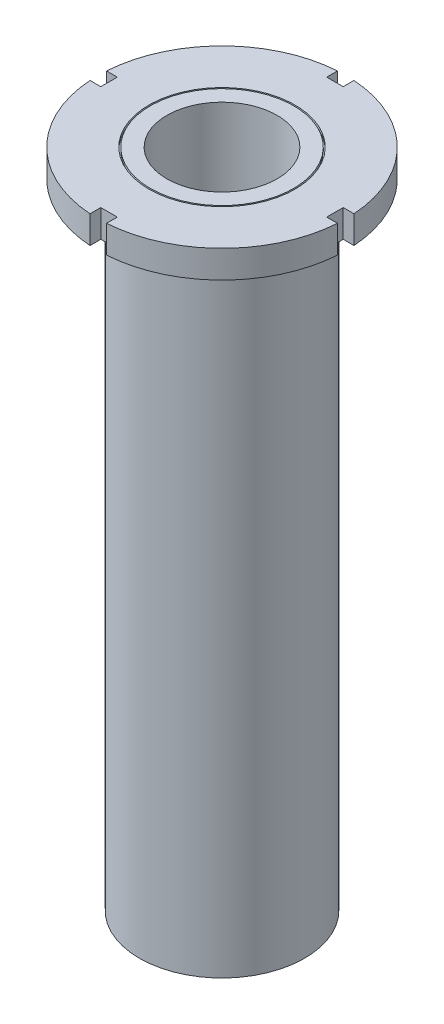
ISO-10303-21;
HEADER;
FILE_DESCRIPTION(('STEP AP214'),'2;1');
FILE_NAME('part.step','',(''),(''),'','','');
FILE_SCHEMA(('AUTOMOTIVE_DESIGN { 1 0 10303 214 1 1 1 1 }'));
ENDSEC;
DATA;
#1=APPLICATION_CONTEXT('core data for automotive mechanical design processes');
#2=APPLICATION_PROTOCOL_DEFINITION('international standard','automotive_design',2000,#1);
#3=PRODUCT_CONTEXT('',#1,'mechanical');
#4=PRODUCT('Part','Part','',(#3));
#5=PRODUCT_RELATED_PRODUCT_CATEGORY('part','',(#4));
#6=PRODUCT_DEFINITION_FORMATION('','',#4);
#7=PRODUCT_DEFINITION_CONTEXT('part definition',#1,'design');
#8=PRODUCT_DEFINITION('design','',#6,#7);
#9=PRODUCT_DEFINITION_SHAPE('','',#8);
#10=(LENGTH_UNIT() NAMED_UNIT(*) SI_UNIT(.MILLI.,.METRE.));
#11=(NAMED_UNIT(*) PLANE_ANGLE_UNIT() SI_UNIT($,.RADIAN.));
#12=(NAMED_UNIT(*) SI_UNIT($,.STERADIAN.) SOLID_ANGLE_UNIT());
#13=UNCERTAINTY_MEASURE_WITH_UNIT(LENGTH_MEASURE(1.E-05),#10,'distance_accuracy_value','');
#14=(GEOMETRIC_REPRESENTATION_CONTEXT(3) GLOBAL_UNCERTAINTY_ASSIGNED_CONTEXT((#13)) GLOBAL_UNIT_ASSIGNED_CONTEXT((#10,
#11,#12)) REPRESENTATION_CONTEXT('',''));
#15=CARTESIAN_POINT('',(0.,0.,0.));
#16=DIRECTION('',(0.,0.,1.));
#17=DIRECTION('',(1.,0.,0.));
#18=AXIS2_PLACEMENT_3D('',#15,#16,#17);
#19=CARTESIAN_POINT('',(0.,0.,0.));
#20=DIRECTION('',(0.,1.,0.));
#21=DIRECTION('',(0.,0.,1.));
#22=AXIS2_PLACEMENT_3D('',#19,#20,#21);
#23=CYLINDRICAL_SURFACE('',#22,10.);
#24=CARTESIAN_POINT('',(0.,0.,0.));
#25=DIRECTION('',(0.,1.,0.));
#26=DIRECTION('',(0.,0.,1.));
#27=AXIS2_PLACEMENT_3D('',#24,#25,#26);
#28=CIRCLE('',#27,10.);
#29=CARTESIAN_POINT('',(0.,0.,10.));
#30=VERTEX_POINT('',#29);
#31=EDGE_CURVE('E292',#30,#30,#28,.T.);
#32=ORIENTED_EDGE('',*,*,#31,.F.);
#33=EDGE_LOOP('',(#32));
#34=FACE_BOUND('',#33,.T.);
#35=CARTESIAN_POINT('',(0.,120.,0.));
#36=DIRECTION('',(0.,1.,0.));
#37=DIRECTION('',(0.,0.,1.));
#38=AXIS2_PLACEMENT_3D('',#35,#36,#37);
#39=CIRCLE('',#38,10.);
#40=CARTESIAN_POINT('',(0.,120.,10.));
#41=VERTEX_POINT('',#40);
#42=EDGE_CURVE('E296',#41,#41,#39,.T.);
#43=ORIENTED_EDGE('',*,*,#42,.T.);
#44=EDGE_LOOP('',(#43));
#45=FACE_BOUND('',#44,.T.);
#46=CARTESIAN_POINT('',(-9.8868599666426,97.5841499443459,1.5));
#47=CARTESIAN_POINT('',(-9.88686136668593,97.500404375056,1.49999654107284));
#48=CARTESIAN_POINT('',(-9.88793551739101,97.4166101935952,1.49296296388491));
#49=CARTESIAN_POINT('',(-9.8921131480324,97.2513646294628,1.46502196657001));
#50=CARTESIAN_POINT('',(-9.8952186073143,97.1699156128659,1.44410101402628));
#51=CARTESIAN_POINT('',(-9.90309938986228,97.011776188899,1.38902526098084));
#52=CARTESIAN_POINT('',(-9.90787343131536,96.9350821818038,1.35488061681397));
#53=CARTESIAN_POINT('',(-9.91855194113145,96.7885229135738,1.27435063087792));
#54=CARTESIAN_POINT('',(-9.92445625383668,96.7186567141316,1.22796697429872));
#55=CARTESIAN_POINT('',(-9.93678289248039,96.5871661275916,1.12387902418559));
#56=CARTESIAN_POINT('',(-9.94320862458057,96.5256043309392,1.06609605584821));
#57=CARTESIAN_POINT('',(-9.95582368169047,96.4130124586904,0.941019605444379));
#58=CARTESIAN_POINT('',(-9.96201299368615,96.3619829621789,0.873725600786532));
#59=CARTESIAN_POINT('',(-9.97349347428185,96.2716733126545,0.731136358052746));
#60=CARTESIAN_POINT('',(-9.97878018435569,96.2324507940234,0.655804227365769));
#61=CARTESIAN_POINT('',(-9.98782206746405,96.1672383455377,0.499528850106976));
#62=CARTESIAN_POINT('',(-9.99157732141945,96.141247716503,0.418585900270678));
#63=CARTESIAN_POINT('',(-9.99710914797782,96.103426555815,0.25403112309057));
#64=CARTESIAN_POINT('',(-9.99890035887344,96.0914912179587,0.170443884389868));
#65=CARTESIAN_POINT('',(-10.0003524476958,96.081794009521,0.00243520401948085));
#66=CARTESIAN_POINT('',(-10.0000134440494,96.0840313510262,-0.0819861910157443));
#67=CARTESIAN_POINT('',(-9.99725499660796,96.1025332821083,-0.248551718200519));
#68=CARTESIAN_POINT('',(-9.99485227652479,96.1186851161374,-0.330708691400009));
#69=CARTESIAN_POINT('',(-9.98825500227851,96.1643805506685,-0.491132829143139));
#70=CARTESIAN_POINT('',(-9.98406040199739,96.1939244958473,-0.569399893513481));
#71=CARTESIAN_POINT('',(-9.97432193873206,96.265680941263,-0.720163780770316));
#72=CARTESIAN_POINT('',(-9.96877303515638,96.3079409094546,-0.792637672323598));
#73=CARTESIAN_POINT('',(-9.95694438245421,96.4038951380159,-0.929507907150179));
#74=CARTESIAN_POINT('',(-9.95066458523184,96.4575901510528,-0.993903718271735));
#75=CARTESIAN_POINT('',(-9.93800158192627,96.5755183931725,-1.11345448272264));
#76=CARTESIAN_POINT('',(-9.93161796623257,96.639850066316,-1.16851232950947));
#77=CARTESIAN_POINT('',(-9.91952704453523,96.7768910214696,-1.26706599338813));
#78=CARTESIAN_POINT('',(-9.91381974269649,96.8496003550658,-1.31056173927999));
#79=CARTESIAN_POINT('',(-9.90372775286855,97.0014339072865,-1.38476964534604));
#80=CARTESIAN_POINT('',(-9.89934409845291,97.0805630780083,-1.41547182270081));
#81=CARTESIAN_POINT('',(-9.89241402899059,97.2429351994933,-1.46312336208879));
#82=CARTESIAN_POINT('',(-9.88986748446299,97.3261778598926,-1.48007369337326));
#83=CARTESIAN_POINT('',(-9.88692451395027,97.4935500339234,-1.49960720086655));
#84=CARTESIAN_POINT('',(-9.88650748802574,97.5776631325474,-1.50232803265052));
#85=CARTESIAN_POINT('',(-9.88781607937153,97.7451441391632,-1.49369057019819));
#86=CARTESIAN_POINT('',(-9.88954163015778,97.8285120701967,-1.48233271282302));
#87=CARTESIAN_POINT('',(-9.89492202461453,97.9917097623115,-1.44597702952766));
#88=CARTESIAN_POINT('',(-9.89856716482858,98.0715551492875,-1.42104778527821));
#89=CARTESIAN_POINT('',(-9.90736801825768,98.2259340363945,-1.35832831947087));
#90=CARTESIAN_POINT('',(-9.91252380607176,98.3004672739741,-1.32053746276389));
#91=CARTESIAN_POINT('',(-9.92381355687063,98.4427232046809,-1.23283677995323));
#92=CARTESIAN_POINT('',(-9.92995459279988,98.5103903916257,-1.18283784561766));
#93=CARTESIAN_POINT('',(-9.94250159433355,98.6364228042197,-1.07226416837201));
#94=CARTESIAN_POINT('',(-9.94890757490292,98.6947875035271,-1.0116888274468));
#95=CARTESIAN_POINT('',(-9.96132705217386,98.8010525509795,-0.881075619628185));
#96=CARTESIAN_POINT('',(-9.96733683460423,98.8488616725884,-0.810963126771956));
#97=CARTESIAN_POINT('',(-9.97822905032016,98.9320228496085,-0.663622080263675));
#98=CARTESIAN_POINT('',(-9.98311151444563,98.9673752458109,-0.586393721360432));
#99=CARTESIAN_POINT('',(-9.99118269660795,99.0244736868339,-0.427297995861141));
#100=CARTESIAN_POINT('',(-9.99437761717899,99.0462696114243,-0.345448858754299));
#101=CARTESIAN_POINT('',(-9.99873976656896,99.0757978238834,-0.179200815501193));
#102=CARTESIAN_POINT('',(-9.99990712930801,99.083531040595,-0.0948020781305819));
#103=CARTESIAN_POINT('',(-10.0000812905914,99.0846916488953,0.0732645908608168));
#104=CARTESIAN_POINT('',(-9.99910917023796,99.0782586252229,0.156931570212051));
#105=CARTESIAN_POINT('',(-9.99515610519141,99.0515685559251,0.321979795323106));
#106=CARTESIAN_POINT('',(-9.99217516692666,99.0313115545373,0.403361048396512));
#107=CARTESIAN_POINT('',(-9.98453786742463,98.9775980687757,0.561489374379661));
#108=CARTESIAN_POINT('',(-9.97988273316947,98.944151249207,0.638239793148785));
#109=CARTESIAN_POINT('',(-9.96940834495499,98.8650224563628,0.785061117896605));
#110=CARTESIAN_POINT('',(-9.96358905320338,98.8193400858656,0.85513180692071));
#111=CARTESIAN_POINT('',(-9.95136510636178,98.7165322455167,0.987312585191958));
#112=CARTESIAN_POINT('',(-9.94495548425942,98.6593037185296,1.04934206644638));
#113=CARTESIAN_POINT('',(-9.93231001689001,98.5352448712654,1.16296808390268));
#114=CARTESIAN_POINT('',(-9.92607421276291,98.4684123005216,1.21456216798984));
#115=CARTESIAN_POINT('',(-9.91444484029116,98.3266009611134,1.30611310822974));
#116=CARTESIAN_POINT('',(-9.90905620156985,98.2515785273241,1.34600294291209));
#117=CARTESIAN_POINT('',(-9.89978909110724,98.0958531675826,1.41255613872045));
#118=CARTESIAN_POINT('',(-9.89590905307931,98.0151562364881,1.43923322574898));
#119=CARTESIAN_POINT('',(-9.89099485524825,97.8757725080894,1.47254951890026));
#120=CARTESIAN_POINT('',(-9.88945249382379,97.8179465474216,1.4828276978042));
#121=CARTESIAN_POINT('',(-9.88738456567012,97.7014716526115,1.49655410576574));
#122=CARTESIAN_POINT('',(-9.88685898576156,97.6428227291463,1.50000242335076));
#123=CARTESIAN_POINT('',(-9.8868599666426,97.5841499443459,1.5));
#124=B_SPLINE_CURVE_WITH_KNOTS('',3,(#46,#47,#48,#49,#50,#51,#52,#53,#54,#55,#56,#57,#58,#59,
#60,#61,#62,#63,#64,#65,#66,#67,#68,#69,#70,#71,#72,#73,#74,#75,#76,#77,#78,#79,#80,#81,#82,#83,
#84,#85,#86,#87,#88,#89,#90,#91,#92,#93,#94,#95,#96,#97,#98,#99,#100,#101,#102,#103,#104,#105,
#106,#107,#108,#109,#110,#111,#112,#113,#114,#115,#116,#117,#118,#119,#120,#121,#122,#123),
.UNSPECIFIED.,.T.,.F.,(4,2,2,2,2,2,2,2,2,2,2,2,2,2,2,2,2,2,2,2,2,2,2,2,2,2,2,2,2,2,2,2,2,2,2,2,
2,2,4),(0.,0.251022251804883,0.5022894695618,0.753364085335661,1.00440414866131,
1.25724158649107,1.51009292207817,1.76415922105782,2.01821209364501,2.27035832534397,
2.52249053939374,2.77259862515728,3.02271314839401,3.27377316386453,3.52484970949273,
3.77839544666269,4.0319427451435,4.28568751773138,4.5394144044434,4.79068214603743,
5.04194209099918,5.29194394807374,5.54195815286117,5.79385486001303,6.04576581461802,
6.29977537753517,6.55377799071856,6.80684040891091,7.05988611170473,7.31044963622327,
7.56101235892823,7.81139182257834,8.06177941567107,8.31450950010969,8.56729890236863,
8.82150878824931,9.07545403445563,9.25132441891614,9.42719252376192),.UNSPECIFIED.);
#125=CARTESIAN_POINT('',(-9.8868599666426,97.5841499443459,1.5));
#126=VERTEX_POINT('',#125);
#127=EDGE_CURVE('E51',#126,#126,#124,.T.);
#128=ORIENTED_EDGE('',*,*,#127,.F.);
#129=EDGE_LOOP('',(#128));
#130=FACE_BOUND('',#129,.T.);
#131=CARTESIAN_POINT('',(9.88685996664259,97.5841499443459,1.5));
#132=CARTESIAN_POINT('',(9.88686136668593,97.6678955136359,1.49999654107284));
#133=CARTESIAN_POINT('',(9.88793551739101,97.7516896950966,1.49296296388491));
#134=CARTESIAN_POINT('',(9.8921131480324,97.916935259229,1.46502196657001));
#135=CARTESIAN_POINT('',(9.8952186073143,97.9983842758259,1.44410101402628));
#136=CARTESIAN_POINT('',(9.90309938986228,98.1565236997928,1.38902526098084));
#137=CARTESIAN_POINT('',(9.90787343131536,98.233217706888,1.35488061681397));
#138=CARTESIAN_POINT('',(9.91855194113145,98.379776975118,1.27435063087792));
#139=CARTESIAN_POINT('',(9.92445625383668,98.4496431745602,1.22796697429872));
#140=CARTESIAN_POINT('',(9.93678289248039,98.5811337611002,1.12387902418559));
#141=CARTESIAN_POINT('',(9.94320862458057,98.6426955577526,1.06609605584821));
#142=CARTESIAN_POINT('',(9.95582368169047,98.7552874300014,0.941019605444379));
#143=CARTESIAN_POINT('',(9.96201299368615,98.8063169265129,0.873725600786532));
#144=CARTESIAN_POINT('',(9.97349347428185,98.8966265760373,0.731136358052746));
#145=CARTESIAN_POINT('',(9.97878018435569,98.9358490946684,0.655804227365769));
#146=CARTESIAN_POINT('',(9.98782206746405,99.0010615431541,0.499528850106977));
#147=CARTESIAN_POINT('',(9.99157732141945,99.0270521721888,0.418585900270679));
#148=CARTESIAN_POINT('',(9.99710914797782,99.0648733328768,0.254031123090571));
#149=CARTESIAN_POINT('',(9.99890035887344,99.0768086707331,0.170443884389868));
#150=CARTESIAN_POINT('',(10.0003524476958,99.0865058791708,0.00243520401948169));
#151=CARTESIAN_POINT('',(10.0000134440494,99.0842685376656,-0.0819861910157435));
#152=CARTESIAN_POINT('',(9.99725499660796,99.0657666065835,-0.248551718200517));
#153=CARTESIAN_POINT('',(9.99485227652479,99.0496147725544,-0.330708691400006));
#154=CARTESIAN_POINT('',(9.98825500227851,99.0039193380233,-0.491132829143136));
#155=CARTESIAN_POINT('',(9.98406040199739,98.9743753928445,-0.56939989351348));
#156=CARTESIAN_POINT('',(9.97432193873206,98.9026189474288,-0.720163780770316));
#157=CARTESIAN_POINT('',(9.96877303515638,98.8603589792372,-0.792637672323598));
#158=CARTESIAN_POINT('',(9.95694438245421,98.7644047506759,-0.929507907150179));
#159=CARTESIAN_POINT('',(9.95066458523184,98.710709737639,-0.993903718271735));
#160=CARTESIAN_POINT('',(9.93800158192627,98.5927814955193,-1.11345448272264));
#161=CARTESIAN_POINT('',(9.93161796623257,98.5284498223758,-1.16851232950947));
#162=CARTESIAN_POINT('',(9.91952704453523,98.3914088672222,-1.26706599338813));
#163=CARTESIAN_POINT('',(9.91381974269649,98.318699533626,-1.31056173927999));
#164=CARTESIAN_POINT('',(9.90372775286855,98.1668659814053,-1.38476964534604));
#165=CARTESIAN_POINT('',(9.89934409845291,98.0877368106835,-1.41547182270081));
#166=CARTESIAN_POINT('',(9.89241402899059,97.9253646891985,-1.46312336208879));
#167=CARTESIAN_POINT('',(9.88986748446299,97.8421220287992,-1.48007369337326));
#168=CARTESIAN_POINT('',(9.88692451395027,97.6747498547684,-1.49960720086655));
#169=CARTESIAN_POINT('',(9.88650748802574,97.5906367561444,-1.50232803265052));
#170=CARTESIAN_POINT('',(9.88781607937153,97.4231557495286,-1.49369057019819));
#171=CARTESIAN_POINT('',(9.88954163015778,97.3397878184951,-1.48233271282302));
#172=CARTESIAN_POINT('',(9.89492202461453,97.1765901263803,-1.44597702952766));
#173=CARTESIAN_POINT('',(9.89856716482858,97.0967447394043,-1.42104778527821));
#174=CARTESIAN_POINT('',(9.90736801825768,96.9423658522973,-1.35832831947087));
#175=CARTESIAN_POINT('',(9.91252380607176,96.8678326147177,-1.32053746276389));
#176=CARTESIAN_POINT('',(9.92381355687063,96.7255766840109,-1.23283677995323));
#177=CARTESIAN_POINT('',(9.92995459279988,96.6579094970661,-1.18283784561766));
#178=CARTESIAN_POINT('',(9.94250159433355,96.5318770844721,-1.07226416837201));
#179=CARTESIAN_POINT('',(9.94890757490292,96.4735123851647,-1.0116888274468));
#180=CARTESIAN_POINT('',(9.96132705217386,96.3672473377123,-0.881075619628185));
#181=CARTESIAN_POINT('',(9.96733683460423,96.3194382161034,-0.810963126771956));
#182=CARTESIAN_POINT('',(9.97822905032016,96.2362770390833,-0.663622080263676));
#183=CARTESIAN_POINT('',(9.98311151444563,96.2009246428809,-0.586393721360432));
#184=CARTESIAN_POINT('',(9.99118269660795,96.1438262018579,-0.427297995861142));
#185=CARTESIAN_POINT('',(9.99437761717899,96.1220302772675,-0.345448858754299));
#186=CARTESIAN_POINT('',(9.99873976656896,96.0925020648084,-0.179200815501193));
#187=CARTESIAN_POINT('',(9.99990712930801,96.0847688480968,-0.0948020781305821));
#188=CARTESIAN_POINT('',(10.0000812905914,96.0836082397965,0.0732645908608167));
#189=CARTESIAN_POINT('',(9.99910917023796,96.0900412634689,0.156931570212051));
#190=CARTESIAN_POINT('',(9.99515610519141,96.1167313327667,0.321979795323106));
#191=CARTESIAN_POINT('',(9.99217516692666,96.1369883341545,0.403361048396511));
#192=CARTESIAN_POINT('',(9.98453786742463,96.1907018199161,0.561489374379661));
#193=CARTESIAN_POINT('',(9.97988273316947,96.2241486394848,0.638239793148785));
#194=CARTESIAN_POINT('',(9.96940834495499,96.3032774323291,0.785061117896605));
#195=CARTESIAN_POINT('',(9.96358905320338,96.3489598028262,0.85513180692071));
#196=CARTESIAN_POINT('',(9.95136510636178,96.4517676431751,0.987312585191963));
#197=CARTESIAN_POINT('',(9.94495548425942,96.5089961701622,1.04934206644639));
#198=CARTESIAN_POINT('',(9.93231001689001,96.6330550174264,1.16296808390268));
#199=CARTESIAN_POINT('',(9.92607421276291,96.6998875881703,1.21456216798984));
#200=CARTESIAN_POINT('',(9.91444484029116,96.8416989275784,1.30611310822974));
#201=CARTESIAN_POINT('',(9.90905620156985,96.9167213613677,1.34600294291209));
#202=CARTESIAN_POINT('',(9.89978909110724,97.0724467211092,1.41255613872045));
#203=CARTESIAN_POINT('',(9.89590905307931,97.1531436522037,1.43923322574898));
#204=CARTESIAN_POINT('',(9.89099485524825,97.2925273806024,1.47254951890026));
#205=CARTESIAN_POINT('',(9.88945249382379,97.3503533412702,1.4828276978042));
#206=CARTESIAN_POINT('',(9.88738456567011,97.4668282360803,1.49655410576574));
#207=CARTESIAN_POINT('',(9.88685898576155,97.5254771595455,1.50000242335076));
#208=CARTESIAN_POINT('',(9.88685996664259,97.5841499443459,1.5));
#209=B_SPLINE_CURVE_WITH_KNOTS('',3,(#131,#132,#133,#134,#135,#136,#137,#138,#139,#140,#141,
#142,#143,#144,#145,#146,#147,#148,#149,#150,#151,#152,#153,#154,#155,#156,#157,#158,#159,#160,
#161,#162,#163,#164,#165,#166,#167,#168,#169,#170,#171,#172,#173,#174,#175,#176,#177,#178,#179,
#180,#181,#182,#183,#184,#185,#186,#187,#188,#189,#190,#191,#192,#193,#194,#195,#196,#197,#198,
#199,#200,#201,#202,#203,#204,#205,#206,#207,#208),.UNSPECIFIED.,.T.,.F.,(4,2,2,2,2,2,2,2,2,2,2,
2,2,2,2,2,2,2,2,2,2,2,2,2,2,2,2,2,2,2,2,2,2,2,2,2,2,2,4),(0.,0.251022251804869,0.5022894695618,
0.753364085335661,1.00440414866131,1.25724158649107,1.51009292207817,1.76415922105782,
2.01821209364501,2.27035832534397,2.52249053939374,2.77259862515728,3.02271314839401,
3.27377316386453,3.52484970949273,3.77839544666269,4.0319427451435,4.28568751773138,
4.5394144044434,4.79068214603743,5.04194209099918,5.29194394807374,5.54195815286117,
5.79385486001303,6.04576581461802,6.29977537753517,6.55377799071856,6.80684040891091,
7.05988611170473,7.31044963622327,7.56101235892823,7.81139182257834,8.06177941567107,
8.31450950010971,8.56729890236863,8.82150878824931,9.07545403445563,9.25132441891614,
9.42719252376192),.UNSPECIFIED.);
#210=CARTESIAN_POINT('',(9.88685996664259,97.5841499443459,1.5));
#211=VERTEX_POINT('',#210);
#212=EDGE_CURVE('E11',#211,#211,#209,.T.);
#213=ORIENTED_EDGE('',*,*,#212,.F.);
#214=EDGE_LOOP('',(#213));
#215=FACE_BOUND('',#214,.T.);
#216=ADVANCED_FACE('F37',(#34,#45,#130,#215),#23,.F.);
#217=CARTESIAN_POINT('',(0.,115.,0.));
#218=DIRECTION('',(0.,-1.,0.));
#219=DIRECTION('',(0.,0.,-1.));
#220=AXIS2_PLACEMENT_3D('',#217,#218,#219);
#221=CYLINDRICAL_SURFACE('',#220,15.);
#222=CARTESIAN_POINT('',(0.,115.,0.));
#223=DIRECTION('',(0.,1.,0.));
#224=DIRECTION('',(0.,0.,1.));
#225=AXIS2_PLACEMENT_3D('',#222,#223,#224);
#226=CIRCLE('',#225,15.);
#227=CARTESIAN_POINT('',(0.,115.,15.));
#228=VERTEX_POINT('',#227);
#229=EDGE_CURVE('E259',#228,#228,#226,.T.);
#230=ORIENTED_EDGE('',*,*,#229,.F.);
#231=EDGE_LOOP('',(#230));
#232=FACE_BOUND('',#231,.T.);
#233=CARTESIAN_POINT('',(0.,0.,0.));
#234=DIRECTION('',(0.,1.,0.));
#235=DIRECTION('',(0.,0.,1.));
#236=AXIS2_PLACEMENT_3D('',#233,#234,#235);
#237=CIRCLE('',#236,15.);
#238=CARTESIAN_POINT('',(0.,0.,15.));
#239=VERTEX_POINT('',#238);
#240=EDGE_CURVE('E258',#239,#239,#237,.T.);
#241=ORIENTED_EDGE('',*,*,#240,.T.);
#242=EDGE_LOOP('',(#241));
#243=FACE_BOUND('',#242,.T.);
#244=ADVANCED_FACE('F39',(#232,#243),#221,.T.);
#245=CARTESIAN_POINT('',(0.,0.,0.));
#246=DIRECTION('',(0.,1.,0.));
#247=DIRECTION('',(0.,0.,1.));
#248=AXIS2_PLACEMENT_3D('',#245,#246,#247);
#249=PLANE('',#248);
#250=ORIENTED_EDGE('',*,*,#31,.T.);
#251=EDGE_LOOP('',(#250));
#252=FACE_BOUND('',#251,.T.);
#253=ORIENTED_EDGE('',*,*,#240,.F.);
#254=EDGE_LOOP('',(#253));
#255=FACE_BOUND('',#254,.T.);
#256=ADVANCED_FACE('F287',(#252,#255),#249,.F.);
#257=CARTESIAN_POINT('',(1.50000000000205,120.,-20.5000000000004));
#258=DIRECTION('',(1.,0.,0.));
#259=DIRECTION('',(0.,0.,-1.));
#260=AXIS2_PLACEMENT_3D('',#257,#258,#259);
#261=PLANE('',#260);
#262=DIRECTION('',(0.,0.,1.));
#263=VECTOR('',#262,1.);
#264=CARTESIAN_POINT('',(1.50000000000205,115.,-20.5000000000004));
#265=LINE('',#264,#263);
#266=CARTESIAN_POINT('',(1.50000000000206,115.,-22.4499443206442));
#267=VERTEX_POINT('',#266);
#268=CARTESIAN_POINT('',(1.50000000000205,115.,-20.5000000000004));
#269=VERTEX_POINT('',#268);
#270=EDGE_CURVE('E188',#267,#269,#265,.T.);
#271=ORIENTED_EDGE('',*,*,#270,.T.);
#272=DIRECTION('',(0.,-1.,0.));
#273=VECTOR('',#272,1.);
#274=CARTESIAN_POINT('',(1.50000000000205,120.,-20.5000000000004));
#275=LINE('',#274,#273);
#276=CARTESIAN_POINT('',(1.50000000000205,120.,-20.5000000000004));
#277=VERTEX_POINT('',#276);
#278=EDGE_CURVE('E256',#277,#269,#275,.T.);
#279=ORIENTED_EDGE('',*,*,#278,.F.);
#280=DIRECTION('',(0.,0.,1.));
#281=VECTOR('',#280,1.);
#282=CARTESIAN_POINT('',(1.50000000000205,120.,-20.5000000000004));
#283=LINE('',#282,#281);
#284=CARTESIAN_POINT('',(1.50000000000206,120.,-22.4499443206442));
#285=VERTEX_POINT('',#284);
#286=EDGE_CURVE('E219',#285,#277,#283,.T.);
#287=ORIENTED_EDGE('',*,*,#286,.F.);
#288=DIRECTION('',(0.,-1.,0.));
#289=VECTOR('',#288,1.);
#290=CARTESIAN_POINT('',(1.50000000000206,120.,-22.4499443206442));
#291=LINE('',#290,#289);
#292=EDGE_CURVE('E184',#285,#267,#291,.T.);
#293=ORIENTED_EDGE('',*,*,#292,.T.);
#294=EDGE_LOOP('',(#271,#279,#287,#293));
#295=FACE_BOUND('',#294,.T.);
#296=ADVANCED_FACE('F351',(#295),#261,.F.);
#297=CARTESIAN_POINT('',(-1.49999999999797,120.,-20.5000000000004));
#298=DIRECTION('',(0.,0.,1.));
#299=DIRECTION('',(1.,0.,0.));
#300=AXIS2_PLACEMENT_3D('',#297,#298,#299);
#301=PLANE('',#300);
#302=DIRECTION('',(-1.,0.,0.));
#303=VECTOR('',#302,1.);
#304=CARTESIAN_POINT('',(-1.49999999999797,115.,-20.5000000000004));
#305=LINE('',#304,#303);
#306=CARTESIAN_POINT('',(-1.49999999999797,115.,-20.5000000000004));
#307=VERTEX_POINT('',#306);
#308=EDGE_CURVE('E191',#269,#307,#305,.T.);
#309=ORIENTED_EDGE('',*,*,#308,.T.);
#310=DIRECTION('',(0.,-1.,0.));
#311=VECTOR('',#310,1.);
#312=CARTESIAN_POINT('',(-1.49999999999797,120.,-20.5000000000004));
#313=LINE('',#312,#311);
#314=CARTESIAN_POINT('',(-1.49999999999797,120.,-20.5000000000004));
#315=VERTEX_POINT('',#314);
#316=EDGE_CURVE('E253',#315,#307,#313,.T.);
#317=ORIENTED_EDGE('',*,*,#316,.F.);
#318=DIRECTION('',(-1.,0.,0.));
#319=VECTOR('',#318,1.);
#320=CARTESIAN_POINT('',(-1.49999999999797,120.,-20.5000000000004));
#321=LINE('',#320,#319);
#322=EDGE_CURVE('E127',#277,#315,#321,.T.);
#323=ORIENTED_EDGE('',*,*,#322,.F.);
#324=ORIENTED_EDGE('',*,*,#278,.T.);
#325=EDGE_LOOP('',(#309,#317,#323,#324));
#326=FACE_BOUND('',#325,.T.);
#327=ADVANCED_FACE('F405',(#326),#301,.F.);
#328=CARTESIAN_POINT('',(-1.49999999999797,120.,-20.5000000000004));
#329=DIRECTION('',(-1.,0.,0.));
#330=DIRECTION('',(0.,0.,1.));
#331=AXIS2_PLACEMENT_3D('',#328,#329,#330);
#332=PLANE('',#331);
#333=DIRECTION('',(0.,0.,-1.));
#334=VECTOR('',#333,1.);
#335=CARTESIAN_POINT('',(-1.49999999999797,115.,-20.5000000000004));
#336=LINE('',#335,#334);
#337=CARTESIAN_POINT('',(-1.49999999999797,115.,-22.4499443206441));
#338=VERTEX_POINT('',#337);
#339=EDGE_CURVE('E194',#307,#338,#336,.T.);
#340=ORIENTED_EDGE('',*,*,#339,.T.);
#341=DIRECTION('',(0.,-1.,0.));
#342=VECTOR('',#341,1.);
#343=CARTESIAN_POINT('',(-1.49999999999797,120.,-22.4499443206441));
#344=LINE('',#343,#342);
#345=CARTESIAN_POINT('',(-1.49999999999797,120.,-22.4499443206441));
#346=VERTEX_POINT('',#345);
#347=EDGE_CURVE('E250',#346,#338,#344,.T.);
#348=ORIENTED_EDGE('',*,*,#347,.F.);
#349=DIRECTION('',(0.,0.,-1.));
#350=VECTOR('',#349,1.);
#351=CARTESIAN_POINT('',(-1.49999999999797,120.,-20.5000000000004));
#352=LINE('',#351,#350);
#353=EDGE_CURVE('E316',#315,#346,#352,.T.);
#354=ORIENTED_EDGE('',*,*,#353,.F.);
#355=ORIENTED_EDGE('',*,*,#316,.T.);
#356=EDGE_LOOP('',(#340,#348,#354,#355));
#357=FACE_BOUND('',#356,.T.);
#358=ADVANCED_FACE('F401',(#357),#332,.F.);
#359=CARTESIAN_POINT('',(2.03656536079677E-12,120.,-1.35958952429682E-13));
#360=DIRECTION('',(0.,-1.,0.));
#361=DIRECTION('',(0.,0.,-1.));
#362=AXIS2_PLACEMENT_3D('',#359,#360,#361);
#363=CYLINDRICAL_SURFACE('',#362,22.5000000000001);
#364=CARTESIAN_POINT('',(2.03656536079677E-12,115.,-1.35958952429682E-13));
#365=DIRECTION('',(0.,1.,0.));
#366=DIRECTION('',(0.,0.,1.));
#367=AXIS2_PLACEMENT_3D('',#364,#365,#366);
#368=CIRCLE('',#367,22.5000000000001);
#369=CARTESIAN_POINT('',(-22.4499443206419,115.,-1.49999999999755));
#370=VERTEX_POINT('',#369);
#371=EDGE_CURVE('E196',#338,#370,#368,.T.);
#372=ORIENTED_EDGE('',*,*,#371,.T.);
#373=DIRECTION('',(0.,-1.,0.));
#374=VECTOR('',#373,1.);
#375=CARTESIAN_POINT('',(-22.4499443206419,120.,-1.49999999999755));
#376=LINE('',#375,#374);
#377=CARTESIAN_POINT('',(-22.4499443206419,120.,-1.49999999999755));
#378=VERTEX_POINT('',#377);
#379=EDGE_CURVE('E247',#378,#370,#376,.T.);
#380=ORIENTED_EDGE('',*,*,#379,.F.);
#381=CARTESIAN_POINT('',(2.03656536079677E-12,120.,-1.35958952429682E-13));
#382=DIRECTION('',(0.,1.,0.));
#383=DIRECTION('',(0.,0.,1.));
#384=AXIS2_PLACEMENT_3D('',#381,#382,#383);
#385=CIRCLE('',#384,22.5000000000001);
#386=EDGE_CURVE('E318',#346,#378,#385,.T.);
#387=ORIENTED_EDGE('',*,*,#386,.F.);
#388=ORIENTED_EDGE('',*,*,#347,.T.);
#389=EDGE_LOOP('',(#372,#380,#387,#388));
#390=FACE_BOUND('',#389,.T.);
#391=ADVANCED_FACE('F397',(#390),#363,.T.);
#392=CARTESIAN_POINT('',(-20.4999999999981,120.,-1.49999999999753));
#393=DIRECTION('',(0.,0.,-1.));
#394=DIRECTION('',(-1.,0.,0.));
#395=AXIS2_PLACEMENT_3D('',#392,#393,#394);
#396=PLANE('',#395);
#397=DIRECTION('',(1.,0.,0.));
#398=VECTOR('',#397,1.);
#399=CARTESIAN_POINT('',(-20.4999999999981,115.,-1.49999999999753));
#400=LINE('',#399,#398);
#401=CARTESIAN_POINT('',(-20.4999999999981,115.,-1.49999999999753));
#402=VERTEX_POINT('',#401);
#403=EDGE_CURVE('E198',#370,#402,#400,.T.);
#404=ORIENTED_EDGE('',*,*,#403,.T.);
#405=DIRECTION('',(0.,-1.,0.));
#406=VECTOR('',#405,1.);
#407=CARTESIAN_POINT('',(-20.4999999999981,120.,-1.49999999999753));
#408=LINE('',#407,#406);
#409=CARTESIAN_POINT('',(-20.4999999999981,120.,-1.49999999999753));
#410=VERTEX_POINT('',#409);
#411=EDGE_CURVE('E244',#410,#402,#408,.T.);
#412=ORIENTED_EDGE('',*,*,#411,.F.);
#413=DIRECTION('',(1.,0.,0.));
#414=VECTOR('',#413,1.);
#415=CARTESIAN_POINT('',(-20.4999999999981,120.,-1.49999999999753));
#416=LINE('',#415,#414);
#417=EDGE_CURVE('E320',#378,#410,#416,.T.);
#418=ORIENTED_EDGE('',*,*,#417,.F.);
#419=ORIENTED_EDGE('',*,*,#379,.T.);
#420=EDGE_LOOP('',(#404,#412,#418,#419));
#421=FACE_BOUND('',#420,.T.);
#422=ADVANCED_FACE('F393',(#421),#396,.F.);
#423=CARTESIAN_POINT('',(-20.4999999999981,120.,1.50000000000246));
#424=DIRECTION('',(1.,0.,0.));
#425=DIRECTION('',(0.,0.,-1.));
#426=AXIS2_PLACEMENT_3D('',#423,#424,#425);
#427=PLANE('',#426);
#428=DIRECTION('',(0.,0.,1.));
#429=VECTOR('',#428,1.);
#430=CARTESIAN_POINT('',(-20.4999999999981,115.,1.50000000000246));
#431=LINE('',#430,#429);
#432=CARTESIAN_POINT('',(-20.4999999999981,115.,1.50000000000246));
#433=VERTEX_POINT('',#432);
#434=EDGE_CURVE('E200',#402,#433,#431,.T.);
#435=ORIENTED_EDGE('',*,*,#434,.T.);
#436=DIRECTION('',(0.,-1.,0.));
#437=VECTOR('',#436,1.);
#438=CARTESIAN_POINT('',(-20.4999999999981,120.,1.50000000000246));
#439=LINE('',#438,#437);
#440=CARTESIAN_POINT('',(-20.4999999999981,120.,1.50000000000246));
#441=VERTEX_POINT('',#440);
#442=EDGE_CURVE('E241',#441,#433,#439,.T.);
#443=ORIENTED_EDGE('',*,*,#442,.F.);
#444=DIRECTION('',(0.,0.,1.));
#445=VECTOR('',#444,1.);
#446=CARTESIAN_POINT('',(-20.4999999999981,120.,1.50000000000246));
#447=LINE('',#446,#445);
#448=EDGE_CURVE('E322',#410,#441,#447,.T.);
#449=ORIENTED_EDGE('',*,*,#448,.F.);
#450=ORIENTED_EDGE('',*,*,#411,.T.);
#451=EDGE_LOOP('',(#435,#443,#449,#450));
#452=FACE_BOUND('',#451,.T.);
#453=ADVANCED_FACE('F389',(#452),#427,.F.);
#454=CARTESIAN_POINT('',(-20.4999999999981,120.,1.50000000000246));
#455=DIRECTION('',(0.,0.,1.));
#456=DIRECTION('',(1.,0.,0.));
#457=AXIS2_PLACEMENT_3D('',#454,#455,#456);
#458=PLANE('',#457);
#459=DIRECTION('',(-1.,0.,0.));
#460=VECTOR('',#459,1.);
#461=CARTESIAN_POINT('',(-20.4999999999981,115.,1.50000000000246));
#462=LINE('',#461,#460);
#463=CARTESIAN_POINT('',(-22.4499443206417,115.,1.50000000000246));
#464=VERTEX_POINT('',#463);
#465=EDGE_CURVE('E202',#433,#464,#462,.T.);
#466=ORIENTED_EDGE('',*,*,#465,.T.);
#467=DIRECTION('',(0.,-1.,0.));
#468=VECTOR('',#467,1.);
#469=CARTESIAN_POINT('',(-22.4499443206417,120.,1.50000000000246));
#470=LINE('',#469,#468);
#471=CARTESIAN_POINT('',(-22.4499443206417,120.,1.50000000000246));
#472=VERTEX_POINT('',#471);
#473=EDGE_CURVE('E238',#472,#464,#470,.T.);
#474=ORIENTED_EDGE('',*,*,#473,.F.);
#475=DIRECTION('',(-1.,0.,0.));
#476=VECTOR('',#475,1.);
#477=CARTESIAN_POINT('',(-20.4999999999981,120.,1.50000000000246));
#478=LINE('',#477,#476);
#479=EDGE_CURVE('E324',#441,#472,#478,.T.);
#480=ORIENTED_EDGE('',*,*,#479,.F.);
#481=ORIENTED_EDGE('',*,*,#442,.T.);
#482=EDGE_LOOP('',(#466,#474,#480,#481));
#483=FACE_BOUND('',#482,.T.);
#484=ADVANCED_FACE('F385',(#483),#458,.F.);
#485=CARTESIAN_POINT('',(2.03656536079677E-12,120.,-1.35958952429682E-13));
#486=DIRECTION('',(0.,-1.,0.));
#487=DIRECTION('',(0.,0.,-1.));
#488=AXIS2_PLACEMENT_3D('',#485,#486,#487);
#489=CYLINDRICAL_SURFACE('',#488,22.5000000000004);
#490=CARTESIAN_POINT('',(2.03656536079677E-12,115.,-1.35958952429682E-13));
#491=DIRECTION('',(0.,1.,0.));
#492=DIRECTION('',(0.,0.,1.));
#493=AXIS2_PLACEMENT_3D('',#490,#491,#492);
#494=CIRCLE('',#493,22.5000000000004);
#495=CARTESIAN_POINT('',(-1.4999999999956,115.,22.4499443206441));
#496=VERTEX_POINT('',#495);
#497=EDGE_CURVE('E204',#464,#496,#494,.T.);
#498=ORIENTED_EDGE('',*,*,#497,.T.);
#499=DIRECTION('',(0.,-1.,0.));
#500=VECTOR('',#499,1.);
#501=CARTESIAN_POINT('',(-1.4999999999956,120.,22.4499443206441));
#502=LINE('',#501,#500);
#503=CARTESIAN_POINT('',(-1.4999999999956,120.,22.4499443206441));
#504=VERTEX_POINT('',#503);
#505=EDGE_CURVE('E235',#504,#496,#502,.T.);
#506=ORIENTED_EDGE('',*,*,#505,.F.);
#507=CARTESIAN_POINT('',(2.03656536079677E-12,120.,-1.35958952429682E-13));
#508=DIRECTION('',(0.,1.,0.));
#509=DIRECTION('',(0.,0.,1.));
#510=AXIS2_PLACEMENT_3D('',#507,#508,#509);
#511=CIRCLE('',#510,22.5000000000004);
#512=EDGE_CURVE('E326',#472,#504,#511,.T.);
#513=ORIENTED_EDGE('',*,*,#512,.F.);
#514=ORIENTED_EDGE('',*,*,#473,.T.);
#515=EDGE_LOOP('',(#498,#506,#513,#514));
#516=FACE_BOUND('',#515,.T.);
#517=ADVANCED_FACE('F381',(#516),#489,.T.);
#518=CARTESIAN_POINT('',(-1.4999999999956,120.,20.5000000000005));
#519=DIRECTION('',(-1.,0.,0.));
#520=DIRECTION('',(0.,0.,1.));
#521=AXIS2_PLACEMENT_3D('',#518,#519,#520);
#522=PLANE('',#521);
#523=DIRECTION('',(0.,0.,-1.));
#524=VECTOR('',#523,1.);
#525=CARTESIAN_POINT('',(-1.4999999999956,115.,20.5000000000005));
#526=LINE('',#525,#524);
#527=CARTESIAN_POINT('',(-1.4999999999956,115.,20.5000000000005));
#528=VERTEX_POINT('',#527);
#529=EDGE_CURVE('E206',#496,#528,#526,.T.);
#530=ORIENTED_EDGE('',*,*,#529,.T.);
#531=DIRECTION('',(0.,-1.,0.));
#532=VECTOR('',#531,1.);
#533=CARTESIAN_POINT('',(-1.4999999999956,120.,20.5000000000005));
#534=LINE('',#533,#532);
#535=CARTESIAN_POINT('',(-1.4999999999956,120.,20.5000000000005));
#536=VERTEX_POINT('',#535);
#537=EDGE_CURVE('E232',#536,#528,#534,.T.);
#538=ORIENTED_EDGE('',*,*,#537,.F.);
#539=DIRECTION('',(0.,0.,-1.));
#540=VECTOR('',#539,1.);
#541=CARTESIAN_POINT('',(-1.4999999999956,120.,20.5000000000005));
#542=LINE('',#541,#540);
#543=EDGE_CURVE('E328',#504,#536,#542,.T.);
#544=ORIENTED_EDGE('',*,*,#543,.F.);
#545=ORIENTED_EDGE('',*,*,#505,.T.);
#546=EDGE_LOOP('',(#530,#538,#544,#545));
#547=FACE_BOUND('',#546,.T.);
#548=ADVANCED_FACE('F377',(#547),#522,.F.);
#549=CARTESIAN_POINT('',(1.5000000000044,120.,20.5000000000005));
#550=DIRECTION('',(0.,0.,-1.));
#551=DIRECTION('',(-1.,0.,0.));
#552=AXIS2_PLACEMENT_3D('',#549,#550,#551);
#553=PLANE('',#552);
#554=DIRECTION('',(1.,0.,0.));
#555=VECTOR('',#554,1.);
#556=CARTESIAN_POINT('',(1.5000000000044,115.,20.5000000000005));
#557=LINE('',#556,#555);
#558=CARTESIAN_POINT('',(1.5000000000044,115.,20.5000000000005));
#559=VERTEX_POINT('',#558);
#560=EDGE_CURVE('E208',#528,#559,#557,.T.);
#561=ORIENTED_EDGE('',*,*,#560,.T.);
#562=DIRECTION('',(0.,-1.,0.));
#563=VECTOR('',#562,1.);
#564=CARTESIAN_POINT('',(1.5000000000044,120.,20.5000000000005));
#565=LINE('',#564,#563);
#566=CARTESIAN_POINT('',(1.5000000000044,120.,20.5000000000005));
#567=VERTEX_POINT('',#566);
#568=EDGE_CURVE('E229',#567,#559,#565,.T.);
#569=ORIENTED_EDGE('',*,*,#568,.F.);
#570=DIRECTION('',(1.,0.,0.));
#571=VECTOR('',#570,1.);
#572=CARTESIAN_POINT('',(1.5000000000044,120.,20.5000000000005));
#573=LINE('',#572,#571);
#574=EDGE_CURVE('E330',#536,#567,#573,.T.);
#575=ORIENTED_EDGE('',*,*,#574,.F.);
#576=ORIENTED_EDGE('',*,*,#537,.T.);
#577=EDGE_LOOP('',(#561,#569,#575,#576));
#578=FACE_BOUND('',#577,.T.);
#579=ADVANCED_FACE('F373',(#578),#553,.F.);
#580=CARTESIAN_POINT('',(1.5000000000044,120.,20.5000000000005));
#581=DIRECTION('',(1.,0.,0.));
#582=DIRECTION('',(0.,0.,-1.));
#583=AXIS2_PLACEMENT_3D('',#580,#581,#582);
#584=PLANE('',#583);
#585=DIRECTION('',(0.,0.,1.));
#586=VECTOR('',#585,1.);
#587=CARTESIAN_POINT('',(1.5000000000044,115.,20.5000000000005));
#588=LINE('',#587,#586);
#589=CARTESIAN_POINT('',(1.50000000000439,115.,22.4499443206442));
#590=VERTEX_POINT('',#589);
#591=EDGE_CURVE('E210',#559,#590,#588,.T.);
#592=ORIENTED_EDGE('',*,*,#591,.T.);
#593=DIRECTION('',(0.,-1.,0.));
#594=VECTOR('',#593,1.);
#595=CARTESIAN_POINT('',(1.50000000000439,120.,22.4499443206442));
#596=LINE('',#595,#594);
#597=CARTESIAN_POINT('',(1.50000000000439,120.,22.4499443206442));
#598=VERTEX_POINT('',#597);
#599=EDGE_CURVE('E226',#598,#590,#596,.T.);
#600=ORIENTED_EDGE('',*,*,#599,.F.);
#601=DIRECTION('',(0.,0.,1.));
#602=VECTOR('',#601,1.);
#603=CARTESIAN_POINT('',(1.5000000000044,120.,20.5000000000005));
#604=LINE('',#603,#602);
#605=EDGE_CURVE('E332',#567,#598,#604,.T.);
#606=ORIENTED_EDGE('',*,*,#605,.F.);
#607=ORIENTED_EDGE('',*,*,#568,.T.);
#608=EDGE_LOOP('',(#592,#600,#606,#607));
#609=FACE_BOUND('',#608,.T.);
#610=ADVANCED_FACE('F370',(#609),#584,.F.);
#611=CARTESIAN_POINT('',(2.03656536079677E-12,120.,-1.35958952429682E-13));
#612=DIRECTION('',(0.,-1.,0.));
#613=DIRECTION('',(0.,0.,-1.));
#614=AXIS2_PLACEMENT_3D('',#611,#612,#613);
#615=CYLINDRICAL_SURFACE('',#614,22.5000000000006);
#616=CARTESIAN_POINT('',(2.03656536079677E-12,115.,-1.35958952429682E-13));
#617=DIRECTION('',(0.,1.,0.));
#618=DIRECTION('',(0.,0.,1.));
#619=AXIS2_PLACEMENT_3D('',#616,#617,#618);
#620=CIRCLE('',#619,22.5000000000006);
#621=CARTESIAN_POINT('',(22.4499443206464,115.,1.49999999999808));
#622=VERTEX_POINT('',#621);
#623=EDGE_CURVE('E212',#590,#622,#620,.T.);
#624=ORIENTED_EDGE('',*,*,#623,.T.);
#625=DIRECTION('',(0.,-1.,0.));
#626=VECTOR('',#625,1.);
#627=CARTESIAN_POINT('',(22.4499443206464,120.,1.49999999999808));
#628=LINE('',#627,#626);
#629=CARTESIAN_POINT('',(22.4499443206464,120.,1.49999999999808));
#630=VERTEX_POINT('',#629);
#631=EDGE_CURVE('E223',#630,#622,#628,.T.);
#632=ORIENTED_EDGE('',*,*,#631,.F.);
#633=CARTESIAN_POINT('',(2.03656536079677E-12,120.,-1.35958952429682E-13));
#634=DIRECTION('',(0.,1.,0.));
#635=DIRECTION('',(0.,0.,1.));
#636=AXIS2_PLACEMENT_3D('',#633,#634,#635);
#637=CIRCLE('',#636,22.5000000000006);
#638=EDGE_CURVE('E334',#598,#630,#637,.T.);
#639=ORIENTED_EDGE('',*,*,#638,.F.);
#640=ORIENTED_EDGE('',*,*,#599,.T.);
#641=EDGE_LOOP('',(#624,#632,#639,#640));
#642=FACE_BOUND('',#641,.T.);
#643=ADVANCED_FACE('F340',(#642),#615,.T.);
#644=CARTESIAN_POINT('',(20.5000000000025,120.,1.49999999999807));
#645=DIRECTION('',(0.,0.,1.));
#646=DIRECTION('',(1.,0.,0.));
#647=AXIS2_PLACEMENT_3D('',#644,#645,#646);
#648=PLANE('',#647);
#649=DIRECTION('',(-1.,0.,0.));
#650=VECTOR('',#649,1.);
#651=CARTESIAN_POINT('',(20.5000000000025,115.,1.49999999999807));
#652=LINE('',#651,#650);
#653=CARTESIAN_POINT('',(20.5000000000025,115.,1.49999999999807));
#654=VERTEX_POINT('',#653);
#655=EDGE_CURVE('E214',#622,#654,#652,.T.);
#656=ORIENTED_EDGE('',*,*,#655,.T.);
#657=DIRECTION('',(0.,-1.,0.));
#658=VECTOR('',#657,1.);
#659=CARTESIAN_POINT('',(20.5000000000025,120.,1.49999999999807));
#660=LINE('',#659,#658);
#661=CARTESIAN_POINT('',(20.5000000000025,120.,1.49999999999807));
#662=VERTEX_POINT('',#661);
#663=EDGE_CURVE('E179',#662,#654,#660,.T.);
#664=ORIENTED_EDGE('',*,*,#663,.F.);
#665=DIRECTION('',(-1.,0.,0.));
#666=VECTOR('',#665,1.);
#667=CARTESIAN_POINT('',(20.5000000000025,120.,1.49999999999807));
#668=LINE('',#667,#666);
#669=EDGE_CURVE('E170',#630,#662,#668,.T.);
#670=ORIENTED_EDGE('',*,*,#669,.F.);
#671=ORIENTED_EDGE('',*,*,#631,.T.);
#672=EDGE_LOOP('',(#656,#664,#670,#671));
#673=FACE_BOUND('',#672,.T.);
#674=ADVANCED_FACE('F344',(#673),#648,.F.);
#675=CARTESIAN_POINT('',(20.5000000000025,120.,-1.50000000000193));
#676=DIRECTION('',(-1.,0.,0.));
#677=DIRECTION('',(0.,0.,1.));
#678=AXIS2_PLACEMENT_3D('',#675,#676,#677);
#679=PLANE('',#678);
#680=DIRECTION('',(0.,0.,-1.));
#681=VECTOR('',#680,1.);
#682=CARTESIAN_POINT('',(20.5000000000025,115.,-1.50000000000193));
#683=LINE('',#682,#681);
#684=CARTESIAN_POINT('',(20.5000000000025,115.,-1.50000000000193));
#685=VERTEX_POINT('',#684);
#686=EDGE_CURVE('E178',#654,#685,#683,.T.);
#687=ORIENTED_EDGE('',*,*,#686,.T.);
#688=DIRECTION('',(0.,-1.,0.));
#689=VECTOR('',#688,1.);
#690=CARTESIAN_POINT('',(20.5000000000025,120.,-1.50000000000193));
#691=LINE('',#690,#689);
#692=CARTESIAN_POINT('',(20.5000000000025,120.,-1.50000000000193));
#693=VERTEX_POINT('',#692);
#694=EDGE_CURVE('E175',#693,#685,#691,.T.);
#695=ORIENTED_EDGE('',*,*,#694,.F.);
#696=DIRECTION('',(0.,0.,-1.));
#697=VECTOR('',#696,1.);
#698=CARTESIAN_POINT('',(20.5000000000025,120.,-1.50000000000193));
#699=LINE('',#698,#697);
#700=EDGE_CURVE('E164',#662,#693,#699,.T.);
#701=ORIENTED_EDGE('',*,*,#700,.F.);
#702=ORIENTED_EDGE('',*,*,#663,.T.);
#703=EDGE_LOOP('',(#687,#695,#701,#702));
#704=FACE_BOUND('',#703,.T.);
#705=ADVANCED_FACE('F176',(#704),#679,.F.);
#706=CARTESIAN_POINT('',(20.5000000000025,120.,-1.50000000000193));
#707=DIRECTION('',(0.,0.,-1.));
#708=DIRECTION('',(-1.,0.,0.));
#709=AXIS2_PLACEMENT_3D('',#706,#707,#708);
#710=PLANE('',#709);
#711=DIRECTION('',(1.,0.,0.));
#712=VECTOR('',#711,1.);
#713=CARTESIAN_POINT('',(20.5000000000025,115.,-1.50000000000193));
#714=LINE('',#713,#712);
#715=CARTESIAN_POINT('',(22.4499443206461,115.,-1.50000000000192));
#716=VERTEX_POINT('',#715);
#717=EDGE_CURVE('E112',#685,#716,#714,.T.);
#718=ORIENTED_EDGE('',*,*,#717,.T.);
#719=DIRECTION('',(0.,-1.,0.));
#720=VECTOR('',#719,1.);
#721=CARTESIAN_POINT('',(22.4499443206461,120.,-1.50000000000192));
#722=LINE('',#721,#720);
#723=CARTESIAN_POINT('',(22.4499443206461,120.,-1.50000000000192));
#724=VERTEX_POINT('',#723);
#725=EDGE_CURVE('E180',#724,#716,#722,.T.);
#726=ORIENTED_EDGE('',*,*,#725,.F.);
#727=DIRECTION('',(1.,0.,0.));
#728=VECTOR('',#727,1.);
#729=CARTESIAN_POINT('',(20.5000000000025,120.,-1.50000000000193));
#730=LINE('',#729,#728);
#731=EDGE_CURVE('E168',#693,#724,#730,.T.);
#732=ORIENTED_EDGE('',*,*,#731,.F.);
#733=ORIENTED_EDGE('',*,*,#694,.T.);
#734=EDGE_LOOP('',(#718,#726,#732,#733));
#735=FACE_BOUND('',#734,.T.);
#736=ADVANCED_FACE('F182',(#735),#710,.F.);
#737=CARTESIAN_POINT('',(2.03656536079677E-12,120.,-1.35958952429682E-13));
#738=DIRECTION('',(0.,-1.,0.));
#739=DIRECTION('',(0.,0.,-1.));
#740=AXIS2_PLACEMENT_3D('',#737,#738,#739);
#741=CYLINDRICAL_SURFACE('',#740,22.5000000000004);
#742=CARTESIAN_POINT('',(2.03656536079677E-12,115.,-1.35958952429682E-13));
#743=DIRECTION('',(0.,1.,0.));
#744=DIRECTION('',(0.,0.,1.));
#745=AXIS2_PLACEMENT_3D('',#742,#743,#744);
#746=CIRCLE('',#745,22.5000000000004);
#747=EDGE_CURVE('E118',#716,#267,#746,.T.);
#748=ORIENTED_EDGE('',*,*,#747,.T.);
#749=ORIENTED_EDGE('',*,*,#292,.F.);
#750=CARTESIAN_POINT('',(2.03656536079677E-12,120.,-1.35958952429682E-13));
#751=DIRECTION('',(0.,1.,0.));
#752=DIRECTION('',(0.,0.,1.));
#753=AXIS2_PLACEMENT_3D('',#750,#751,#752);
#754=CIRCLE('',#753,22.5000000000004);
#755=EDGE_CURVE('E59',#724,#285,#754,.T.);
#756=ORIENTED_EDGE('',*,*,#755,.F.);
#757=ORIENTED_EDGE('',*,*,#725,.T.);
#758=EDGE_LOOP('',(#748,#749,#756,#757));
#759=FACE_BOUND('',#758,.T.);
#760=ADVANCED_FACE('F353',(#759),#741,.T.);
#761=CARTESIAN_POINT('',(2.03656536079677E-12,120.,-1.35958952429682E-13));
#762=DIRECTION('',(0.,1.,0.));
#763=DIRECTION('',(0.,0.,1.));
#764=AXIS2_PLACEMENT_3D('',#761,#762,#763);
#765=PLANE('',#764);
#766=CARTESIAN_POINT('',(0.,120.,0.));
#767=DIRECTION('',(0.,1.,0.));
#768=DIRECTION('',(0.,0.,1.));
#769=AXIS2_PLACEMENT_3D('',#766,#767,#768);
#770=CIRCLE('',#769,13.25);
#771=CARTESIAN_POINT('',(0.,120.,13.25));
#772=VERTEX_POINT('',#771);
#773=EDGE_CURVE('E307',#772,#772,#770,.T.);
#774=ORIENTED_EDGE('',*,*,#773,.F.);
#775=EDGE_LOOP('',(#774));
#776=FACE_BOUND('',#775,.T.);
#777=ORIENTED_EDGE('',*,*,#286,.T.);
#778=ORIENTED_EDGE('',*,*,#322,.T.);
#779=ORIENTED_EDGE('',*,*,#353,.T.);
#780=ORIENTED_EDGE('',*,*,#386,.T.);
#781=ORIENTED_EDGE('',*,*,#417,.T.);
#782=ORIENTED_EDGE('',*,*,#448,.T.);
#783=ORIENTED_EDGE('',*,*,#479,.T.);
#784=ORIENTED_EDGE('',*,*,#512,.T.);
#785=ORIENTED_EDGE('',*,*,#543,.T.);
#786=ORIENTED_EDGE('',*,*,#574,.T.);
#787=ORIENTED_EDGE('',*,*,#605,.T.);
#788=ORIENTED_EDGE('',*,*,#638,.T.);
#789=ORIENTED_EDGE('',*,*,#669,.T.);
#790=ORIENTED_EDGE('',*,*,#700,.T.);
#791=ORIENTED_EDGE('',*,*,#731,.T.);
#792=ORIENTED_EDGE('',*,*,#755,.T.);
#793=EDGE_LOOP('',(#777,#778,#779,#780,#781,#782,#783,#784,#785,#786,#787,#788,#789,#790,#791,#792));
#794=FACE_BOUND('',#793,.T.);
#795=ADVANCED_FACE('F166',(#776,#794),#765,.T.);
#796=CARTESIAN_POINT('',(2.03656536079677E-12,115.,-1.35958952429682E-13));
#797=DIRECTION('',(0.,1.,0.));
#798=DIRECTION('',(0.,0.,1.));
#799=AXIS2_PLACEMENT_3D('',#796,#797,#798);
#800=PLANE('',#799);
#801=ORIENTED_EDGE('',*,*,#229,.T.);
#802=EDGE_LOOP('',(#801));
#803=FACE_BOUND('',#802,.T.);
#804=ORIENTED_EDGE('',*,*,#270,.F.);
#805=ORIENTED_EDGE('',*,*,#747,.F.);
#806=ORIENTED_EDGE('',*,*,#717,.F.);
#807=ORIENTED_EDGE('',*,*,#686,.F.);
#808=ORIENTED_EDGE('',*,*,#655,.F.);
#809=ORIENTED_EDGE('',*,*,#623,.F.);
#810=ORIENTED_EDGE('',*,*,#591,.F.);
#811=ORIENTED_EDGE('',*,*,#560,.F.);
#812=ORIENTED_EDGE('',*,*,#529,.F.);
#813=ORIENTED_EDGE('',*,*,#497,.F.);
#814=ORIENTED_EDGE('',*,*,#465,.F.);
#815=ORIENTED_EDGE('',*,*,#434,.F.);
#816=ORIENTED_EDGE('',*,*,#403,.F.);
#817=ORIENTED_EDGE('',*,*,#371,.F.);
#818=ORIENTED_EDGE('',*,*,#339,.F.);
#819=ORIENTED_EDGE('',*,*,#308,.F.);
#820=EDGE_LOOP('',(#804,#805,#806,#807,#808,#809,#810,#811,#812,#813,#814,#815,#816,#817,#818,#819));
#821=FACE_BOUND('',#820,.T.);
#822=ADVANCED_FACE('F347',(#803,#821),#800,.F.);
#823=CARTESIAN_POINT('',(0.,119.5,0.));
#824=DIRECTION('',(0.,1.,0.));
#825=DIRECTION('',(0.,0.,1.));
#826=AXIS2_PLACEMENT_3D('',#823,#824,#825);
#827=CYLINDRICAL_SURFACE('',#826,13.25);
#828=CARTESIAN_POINT('',(0.,119.5,0.));
#829=DIRECTION('',(0.,1.,0.));
#830=DIRECTION('',(0.,0.,1.));
#831=AXIS2_PLACEMENT_3D('',#828,#829,#830);
#832=CIRCLE('',#831,13.25);
#833=CARTESIAN_POINT('',(0.,119.5,13.25));
#834=VERTEX_POINT('',#833);
#835=EDGE_CURVE('E192',#834,#834,#832,.T.);
#836=ORIENTED_EDGE('',*,*,#835,.F.);
#837=EDGE_LOOP('',(#836));
#838=FACE_BOUND('',#837,.T.);
#839=ORIENTED_EDGE('',*,*,#773,.T.);
#840=EDGE_LOOP('',(#839));
#841=FACE_BOUND('',#840,.T.);
#842=ADVANCED_FACE('F495',(#838,#841),#827,.F.);
#843=CARTESIAN_POINT('',(0.,119.5,0.));
#844=DIRECTION('',(0.,1.,0.));
#845=DIRECTION('',(0.,0.,1.));
#846=AXIS2_PLACEMENT_3D('',#843,#844,#845);
#847=PLANE('',#846);
#848=CARTESIAN_POINT('',(0.,119.5,0.));
#849=DIRECTION('',(0.,1.,0.));
#850=DIRECTION('',(0.,0.,1.));
#851=AXIS2_PLACEMENT_3D('',#848,#849,#850);
#852=CIRCLE('',#851,13.);
#853=CARTESIAN_POINT('',(0.,119.5,13.));
#854=VERTEX_POINT('',#853);
#855=EDGE_CURVE('E304',#854,#854,#852,.T.);
#856=ORIENTED_EDGE('',*,*,#855,.F.);
#857=EDGE_LOOP('',(#856));
#858=FACE_BOUND('',#857,.T.);
#859=ORIENTED_EDGE('',*,*,#835,.T.);
#860=EDGE_LOOP('',(#859));
#861=FACE_BOUND('',#860,.T.);
#862=ADVANCED_FACE('F510',(#858,#861),#847,.T.);
#863=CARTESIAN_POINT('',(0.,119.5,0.));
#864=DIRECTION('',(0.,1.,0.));
#865=DIRECTION('',(0.,0.,1.));
#866=AXIS2_PLACEMENT_3D('',#863,#864,#865);
#867=CYLINDRICAL_SURFACE('',#866,13.);
#868=ORIENTED_EDGE('',*,*,#855,.T.);
#869=EDGE_LOOP('',(#868));
#870=FACE_BOUND('',#869,.T.);
#871=CARTESIAN_POINT('',(0.,120.,0.));
#872=DIRECTION('',(0.,1.,0.));
#873=DIRECTION('',(0.,0.,1.));
#874=AXIS2_PLACEMENT_3D('',#871,#872,#873);
#875=CIRCLE('',#874,13.);
#876=CARTESIAN_POINT('',(0.,120.,13.));
#877=VERTEX_POINT('',#876);
#878=EDGE_CURVE('E301',#877,#877,#875,.T.);
#879=ORIENTED_EDGE('',*,*,#878,.F.);
#880=EDGE_LOOP('',(#879));
#881=FACE_BOUND('',#880,.T.);
#882=ADVANCED_FACE('F278',(#870,#881),#867,.T.);
#883=ORIENTED_EDGE('',*,*,#42,.F.);
#884=EDGE_LOOP('',(#883));
#885=FACE_BOUND('',#884,.T.);
#886=ORIENTED_EDGE('',*,*,#878,.T.);
#887=EDGE_LOOP('',(#886));
#888=FACE_BOUND('',#887,.T.);
#889=ADVANCED_FACE('F272',(#885,#888),#765,.T.);
#890=CARTESIAN_POINT('',(10.35,97.5841499443459,0.));
#891=DIRECTION('',(-1.,0.,0.));
#892=DIRECTION('',(0.,0.,1.));
#893=AXIS2_PLACEMENT_3D('',#890,#891,#892);
#894=CYLINDRICAL_SURFACE('',#893,1.5);
#895=ORIENTED_EDGE('',*,*,#127,.T.);
#896=EDGE_LOOP('',(#895));
#897=FACE_BOUND('',#896,.T.);
#898=ORIENTED_EDGE('',*,*,#212,.T.);
#899=EDGE_LOOP('',(#898));
#900=FACE_BOUND('',#899,.T.);
#901=ADVANCED_FACE('F269',(#897,#900),#894,.T.);
#902=CLOSED_SHELL('',(#216,#244,#256,#296,#327,#358,#391,#422,#453,#484,#517,#548,#579,#610,
#643,#674,#705,#736,#760,#795,#822,#842,#862,#882,#889,#901));
#903=MANIFOLD_SOLID_BREP('B2',#902);
#904=ADVANCED_BREP_SHAPE_REPRESENTATION('',(#18,#903),#14);
#905=SHAPE_DEFINITION_REPRESENTATION(#9,#904);
ENDSEC;
END-ISO-10303-21;
